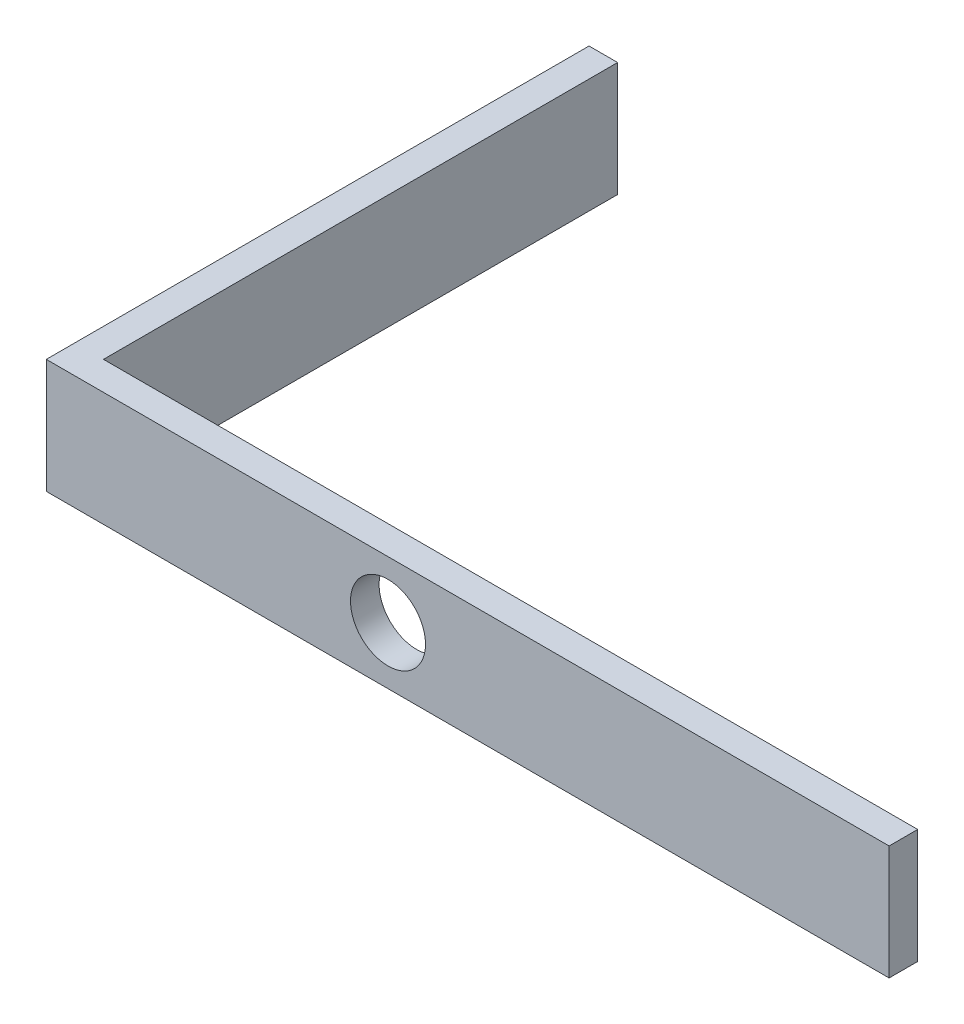
ISO-10303-21;
HEADER;
FILE_DESCRIPTION(('STEP AP214'),'2;1');
FILE_NAME('part.step','',(''),(''),'','','');
FILE_SCHEMA(('AUTOMOTIVE_DESIGN { 1 0 10303 214 1 1 1 1 }'));
ENDSEC;
DATA;
#1=APPLICATION_CONTEXT('core data for automotive mechanical design processes');
#2=APPLICATION_PROTOCOL_DEFINITION('international standard','automotive_design',2000,#1);
#3=PRODUCT_CONTEXT('',#1,'mechanical');
#4=PRODUCT('Part','Part','',(#3));
#5=PRODUCT_RELATED_PRODUCT_CATEGORY('part','',(#4));
#6=PRODUCT_DEFINITION_FORMATION('','',#4);
#7=PRODUCT_DEFINITION_CONTEXT('part definition',#1,'design');
#8=PRODUCT_DEFINITION('design','',#6,#7);
#9=PRODUCT_DEFINITION_SHAPE('','',#8);
#10=(LENGTH_UNIT() NAMED_UNIT(*) SI_UNIT(.MILLI.,.METRE.));
#11=(NAMED_UNIT(*) PLANE_ANGLE_UNIT() SI_UNIT($,.RADIAN.));
#12=(NAMED_UNIT(*) SI_UNIT($,.STERADIAN.) SOLID_ANGLE_UNIT());
#13=UNCERTAINTY_MEASURE_WITH_UNIT(LENGTH_MEASURE(1.E-05),#10,'distance_accuracy_value','');
#14=(GEOMETRIC_REPRESENTATION_CONTEXT(3) GLOBAL_UNCERTAINTY_ASSIGNED_CONTEXT((#13)) GLOBAL_UNIT_ASSIGNED_CONTEXT((#10,
#11,#12)) REPRESENTATION_CONTEXT('',''));
#15=CARTESIAN_POINT('',(0.,0.,0.));
#16=DIRECTION('',(0.,0.,1.));
#17=DIRECTION('',(1.,0.,0.));
#18=AXIS2_PLACEMENT_3D('',#15,#16,#17);
#19=CARTESIAN_POINT('',(0.,7.9375,0.));
#20=DIRECTION('',(1.,0.,0.));
#21=DIRECTION('',(0.,0.,-1.));
#22=AXIS2_PLACEMENT_3D('',#19,#20,#21);
#23=PLANE('',#22);
#24=DIRECTION('',(0.,0.,1.));
#25=VECTOR('',#24,1.);
#26=CARTESIAN_POINT('',(0.,-7.9375,0.));
#27=LINE('',#26,#25);
#28=CARTESIAN_POINT('',(0.,-7.9375,-75.34275));
#29=VERTEX_POINT('',#28);
#30=CARTESIAN_POINT('',(0.,-7.9375,0.));
#31=VERTEX_POINT('',#30);
#32=EDGE_CURVE('E128',#29,#31,#27,.T.);
#33=ORIENTED_EDGE('',*,*,#32,.T.);
#34=DIRECTION('',(0.,-1.,0.));
#35=VECTOR('',#34,1.);
#36=CARTESIAN_POINT('',(0.,7.9375,0.));
#37=LINE('',#36,#35);
#38=CARTESIAN_POINT('',(0.,7.9375,0.));
#39=VERTEX_POINT('',#38);
#40=EDGE_CURVE('E11',#39,#31,#37,.T.);
#41=ORIENTED_EDGE('',*,*,#40,.F.);
#42=DIRECTION('',(0.,0.,1.));
#43=VECTOR('',#42,1.);
#44=CARTESIAN_POINT('',(0.,7.9375,0.));
#45=LINE('',#44,#43);
#46=CARTESIAN_POINT('',(0.,7.9375,-75.34275));
#47=VERTEX_POINT('',#46);
#48=EDGE_CURVE('E145',#47,#39,#45,.T.);
#49=ORIENTED_EDGE('',*,*,#48,.F.);
#50=DIRECTION('',(0.,-1.,0.));
#51=VECTOR('',#50,1.);
#52=CARTESIAN_POINT('',(0.,7.9375,-75.34275));
#53=LINE('',#52,#51);
#54=EDGE_CURVE('E124',#47,#29,#53,.T.);
#55=ORIENTED_EDGE('',*,*,#54,.T.);
#56=EDGE_LOOP('',(#33,#41,#49,#55));
#57=FACE_BOUND('',#56,.T.);
#58=ADVANCED_FACE('F39',(#57),#23,.F.);
#59=CARTESIAN_POINT('',(3.96875,7.9375,0.));
#60=DIRECTION('',(0.,0.,-1.));
#61=DIRECTION('',(-1.,0.,0.));
#62=AXIS2_PLACEMENT_3D('',#59,#60,#61);
#63=PLANE('',#62);
#64=CARTESIAN_POINT('',(47.4345,0.,0.));
#65=DIRECTION('',(0.,0.,1.));
#66=DIRECTION('',(1.,0.,0.));
#67=AXIS2_PLACEMENT_3D('',#64,#65,#66);
#68=CIRCLE('',#67,5.207);
#69=CARTESIAN_POINT('',(52.6415,0.,0.));
#70=VERTEX_POINT('',#69);
#71=EDGE_CURVE('E192',#70,#70,#68,.T.);
#72=ORIENTED_EDGE('',*,*,#71,.F.);
#73=EDGE_LOOP('',(#72));
#74=FACE_BOUND('',#73,.T.);
#75=DIRECTION('',(1.,0.,0.));
#76=VECTOR('',#75,1.);
#77=CARTESIAN_POINT('',(3.96875,-7.9375,0.));
#78=LINE('',#77,#76);
#79=CARTESIAN_POINT('',(116.99875,-7.9375,0.));
#80=VERTEX_POINT('',#79);
#81=EDGE_CURVE('E132',#31,#80,#78,.T.);
#82=ORIENTED_EDGE('',*,*,#81,.T.);
#83=DIRECTION('',(0.,-1.,0.));
#84=VECTOR('',#83,1.);
#85=CARTESIAN_POINT('',(116.99875,7.9375,0.));
#86=LINE('',#85,#84);
#87=CARTESIAN_POINT('',(116.99875,7.9375,0.));
#88=VERTEX_POINT('',#87);
#89=EDGE_CURVE('E48',#88,#80,#86,.T.);
#90=ORIENTED_EDGE('',*,*,#89,.F.);
#91=DIRECTION('',(1.,0.,0.));
#92=VECTOR('',#91,1.);
#93=CARTESIAN_POINT('',(0.,7.9375,0.));
#94=LINE('',#93,#92);
#95=EDGE_CURVE('E93',#39,#88,#94,.T.);
#96=ORIENTED_EDGE('',*,*,#95,.F.);
#97=ORIENTED_EDGE('',*,*,#40,.T.);
#98=EDGE_LOOP('',(#82,#90,#96,#97));
#99=FACE_BOUND('',#98,.T.);
#100=ADVANCED_FACE('F173',(#74,#99),#63,.F.);
#101=CARTESIAN_POINT('',(116.99875,7.9375,0.));
#102=DIRECTION('',(-1.,0.,0.));
#103=DIRECTION('',(0.,0.,1.));
#104=AXIS2_PLACEMENT_3D('',#101,#102,#103);
#105=PLANE('',#104);
#106=DIRECTION('',(0.,0.,-1.));
#107=VECTOR('',#106,1.);
#108=CARTESIAN_POINT('',(116.99875,-7.9375,0.));
#109=LINE('',#108,#107);
#110=CARTESIAN_POINT('',(116.99875,-7.9375,-3.96875000000001));
#111=VERTEX_POINT('',#110);
#112=EDGE_CURVE('E136',#80,#111,#109,.T.);
#113=ORIENTED_EDGE('',*,*,#112,.T.);
#114=DIRECTION('',(0.,-1.,0.));
#115=VECTOR('',#114,1.);
#116=CARTESIAN_POINT('',(116.99875,7.9375,-3.96875000000001));
#117=LINE('',#116,#115);
#118=CARTESIAN_POINT('',(116.99875,7.9375,-3.96875000000001));
#119=VERTEX_POINT('',#118);
#120=EDGE_CURVE('E117',#119,#111,#117,.T.);
#121=ORIENTED_EDGE('',*,*,#120,.F.);
#122=DIRECTION('',(0.,0.,-1.));
#123=VECTOR('',#122,1.);
#124=CARTESIAN_POINT('',(116.99875,7.9375,0.));
#125=LINE('',#124,#123);
#126=EDGE_CURVE('E106',#88,#119,#125,.T.);
#127=ORIENTED_EDGE('',*,*,#126,.F.);
#128=ORIENTED_EDGE('',*,*,#89,.T.);
#129=EDGE_LOOP('',(#113,#121,#127,#128));
#130=FACE_BOUND('',#129,.T.);
#131=ADVANCED_FACE('F155',(#130),#105,.F.);
#132=CARTESIAN_POINT('',(3.96875,7.9375,-3.96875));
#133=DIRECTION('',(0.,0.,1.));
#134=DIRECTION('',(1.,0.,0.));
#135=AXIS2_PLACEMENT_3D('',#132,#133,#134);
#136=PLANE('',#135);
#137=CARTESIAN_POINT('',(47.4345,0.,-3.96875));
#138=DIRECTION('',(0.,0.,1.));
#139=DIRECTION('',(1.,0.,0.));
#140=AXIS2_PLACEMENT_3D('',#137,#138,#139);
#141=CIRCLE('',#140,5.207);
#142=CARTESIAN_POINT('',(52.6415,0.,-3.96875));
#143=VERTEX_POINT('',#142);
#144=EDGE_CURVE('E133',#143,#143,#141,.F.);
#145=ORIENTED_EDGE('',*,*,#144,.F.);
#146=EDGE_LOOP('',(#145));
#147=FACE_BOUND('',#146,.T.);
#148=DIRECTION('',(-1.,0.,0.));
#149=VECTOR('',#148,1.);
#150=CARTESIAN_POINT('',(3.96875,-7.9375,-3.96875));
#151=LINE('',#150,#149);
#152=CARTESIAN_POINT('',(3.96875,-7.9375,-3.96875));
#153=VERTEX_POINT('',#152);
#154=EDGE_CURVE('E115',#111,#153,#151,.T.);
#155=ORIENTED_EDGE('',*,*,#154,.T.);
#156=DIRECTION('',(0.,-1.,0.));
#157=VECTOR('',#156,1.);
#158=CARTESIAN_POINT('',(3.96875,7.9375,-3.96875));
#159=LINE('',#158,#157);
#160=CARTESIAN_POINT('',(3.96875,7.9375,-3.96875));
#161=VERTEX_POINT('',#160);
#162=EDGE_CURVE('E112',#161,#153,#159,.T.);
#163=ORIENTED_EDGE('',*,*,#162,.F.);
#164=DIRECTION('',(-1.,0.,0.));
#165=VECTOR('',#164,1.);
#166=CARTESIAN_POINT('',(3.96875,7.9375,-3.96875));
#167=LINE('',#166,#165);
#168=EDGE_CURVE('E100',#119,#161,#167,.T.);
#169=ORIENTED_EDGE('',*,*,#168,.F.);
#170=ORIENTED_EDGE('',*,*,#120,.T.);
#171=EDGE_LOOP('',(#155,#163,#169,#170));
#172=FACE_BOUND('',#171,.T.);
#173=ADVANCED_FACE('F113',(#147,#172),#136,.F.);
#174=CARTESIAN_POINT('',(3.96875,7.9375,-3.96875));
#175=DIRECTION('',(-1.,0.,0.));
#176=DIRECTION('',(0.,0.,1.));
#177=AXIS2_PLACEMENT_3D('',#174,#175,#176);
#178=PLANE('',#177);
#179=DIRECTION('',(0.,0.,-1.));
#180=VECTOR('',#179,1.);
#181=CARTESIAN_POINT('',(3.96875,-7.9375,-3.96875));
#182=LINE('',#181,#180);
#183=CARTESIAN_POINT('',(3.96875,-7.9375,-75.34275));
#184=VERTEX_POINT('',#183);
#185=EDGE_CURVE('E79',#153,#184,#182,.T.);
#186=ORIENTED_EDGE('',*,*,#185,.T.);
#187=DIRECTION('',(0.,-1.,0.));
#188=VECTOR('',#187,1.);
#189=CARTESIAN_POINT('',(3.96875,7.9375,-75.34275));
#190=LINE('',#189,#188);
#191=CARTESIAN_POINT('',(3.96875,7.9375,-75.34275));
#192=VERTEX_POINT('',#191);
#193=EDGE_CURVE('E118',#192,#184,#190,.T.);
#194=ORIENTED_EDGE('',*,*,#193,.F.);
#195=DIRECTION('',(0.,0.,-1.));
#196=VECTOR('',#195,1.);
#197=CARTESIAN_POINT('',(3.96875,7.9375,-3.96875));
#198=LINE('',#197,#196);
#199=EDGE_CURVE('E104',#161,#192,#198,.T.);
#200=ORIENTED_EDGE('',*,*,#199,.F.);
#201=ORIENTED_EDGE('',*,*,#162,.T.);
#202=EDGE_LOOP('',(#186,#194,#200,#201));
#203=FACE_BOUND('',#202,.T.);
#204=ADVANCED_FACE('F120',(#203),#178,.F.);
#205=CARTESIAN_POINT('',(0.,7.9375,-75.34275));
#206=DIRECTION('',(0.,0.,1.));
#207=DIRECTION('',(1.,0.,0.));
#208=AXIS2_PLACEMENT_3D('',#205,#206,#207);
#209=PLANE('',#208);
#210=DIRECTION('',(-1.,0.,0.));
#211=VECTOR('',#210,1.);
#212=CARTESIAN_POINT('',(0.,-7.9375,-75.34275));
#213=LINE('',#212,#211);
#214=EDGE_CURVE('E85',#184,#29,#213,.T.);
#215=ORIENTED_EDGE('',*,*,#214,.T.);
#216=ORIENTED_EDGE('',*,*,#54,.F.);
#217=DIRECTION('',(-1.,0.,0.));
#218=VECTOR('',#217,1.);
#219=CARTESIAN_POINT('',(0.,7.9375,-75.34275));
#220=LINE('',#219,#218);
#221=EDGE_CURVE('E56',#192,#47,#220,.T.);
#222=ORIENTED_EDGE('',*,*,#221,.F.);
#223=ORIENTED_EDGE('',*,*,#193,.T.);
#224=EDGE_LOOP('',(#215,#216,#222,#223));
#225=FACE_BOUND('',#224,.T.);
#226=ADVANCED_FACE('F162',(#225),#209,.F.);
#227=CARTESIAN_POINT('',(0.,7.9375,0.));
#228=DIRECTION('',(0.,-1.,0.));
#229=DIRECTION('',(0.,0.,-1.));
#230=AXIS2_PLACEMENT_3D('',#227,#228,#229);
#231=PLANE('',#230);
#232=ORIENTED_EDGE('',*,*,#48,.T.);
#233=ORIENTED_EDGE('',*,*,#95,.T.);
#234=ORIENTED_EDGE('',*,*,#126,.T.);
#235=ORIENTED_EDGE('',*,*,#168,.T.);
#236=ORIENTED_EDGE('',*,*,#199,.T.);
#237=ORIENTED_EDGE('',*,*,#221,.T.);
#238=EDGE_LOOP('',(#232,#233,#234,#235,#236,#237));
#239=FACE_BOUND('',#238,.T.);
#240=ADVANCED_FACE('F102',(#239),#231,.F.);
#241=CARTESIAN_POINT('',(0.,-7.9375,0.));
#242=DIRECTION('',(0.,-1.,0.));
#243=DIRECTION('',(0.,0.,-1.));
#244=AXIS2_PLACEMENT_3D('',#241,#242,#243);
#245=PLANE('',#244);
#246=ORIENTED_EDGE('',*,*,#32,.F.);
#247=ORIENTED_EDGE('',*,*,#214,.F.);
#248=ORIENTED_EDGE('',*,*,#185,.F.);
#249=ORIENTED_EDGE('',*,*,#154,.F.);
#250=ORIENTED_EDGE('',*,*,#112,.F.);
#251=ORIENTED_EDGE('',*,*,#81,.F.);
#252=EDGE_LOOP('',(#246,#247,#248,#249,#250,#251));
#253=FACE_BOUND('',#252,.T.);
#254=ADVANCED_FACE('F158',(#253),#245,.T.);
#255=CARTESIAN_POINT('',(47.4345,0.,-18.6963700385534));
#256=DIRECTION('',(0.,0.,1.));
#257=DIRECTION('',(1.,0.,0.));
#258=AXIS2_PLACEMENT_3D('',#255,#256,#257);
#259=CYLINDRICAL_SURFACE('',#258,5.207);
#260=ORIENTED_EDGE('',*,*,#144,.T.);
#261=EDGE_LOOP('',(#260));
#262=FACE_BOUND('',#261,.T.);
#263=ORIENTED_EDGE('',*,*,#71,.T.);
#264=EDGE_LOOP('',(#263));
#265=FACE_BOUND('',#264,.T.);
#266=ADVANCED_FACE('F203',(#262,#265),#259,.F.);
#267=CLOSED_SHELL('',(#58,#100,#131,#173,#204,#226,#240,#254,#266));
#268=MANIFOLD_SOLID_BREP('B2',#267);
#269=ADVANCED_BREP_SHAPE_REPRESENTATION('',(#18,#268),#14);
#270=SHAPE_DEFINITION_REPRESENTATION(#9,#269);
ENDSEC;
END-ISO-10303-21;
